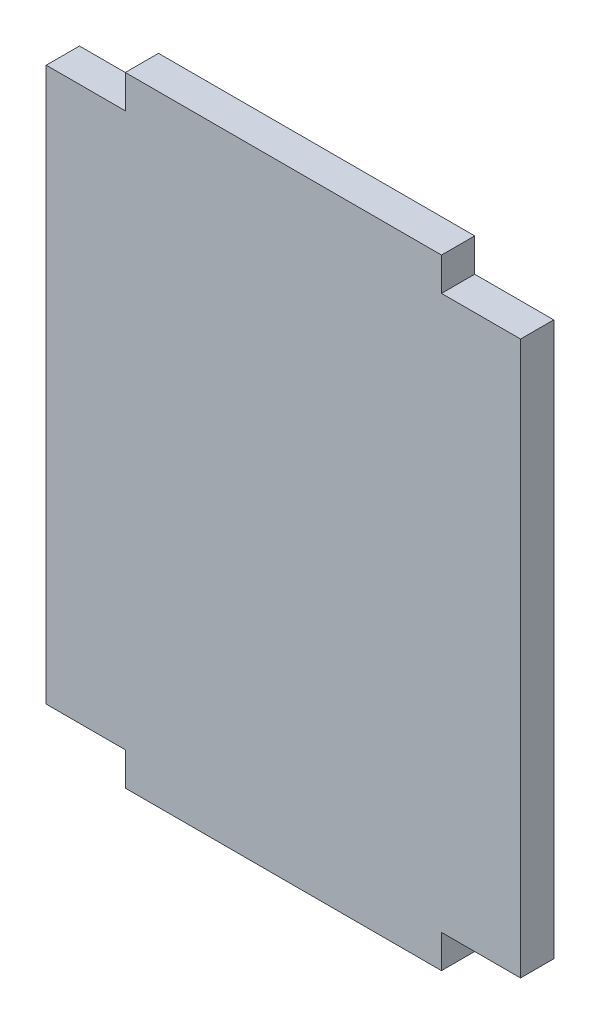
ISO-10303-21;
HEADER;
FILE_DESCRIPTION(('STEP AP214'),'2;1');
FILE_NAME('part.step','',(''),(''),'','','');
FILE_SCHEMA(('AUTOMOTIVE_DESIGN { 1 0 10303 214 1 1 1 1 }'));
ENDSEC;
DATA;
#1=APPLICATION_CONTEXT('core data for automotive mechanical design processes');
#2=APPLICATION_PROTOCOL_DEFINITION('international standard','automotive_design',2000,#1);
#3=PRODUCT_CONTEXT('',#1,'mechanical');
#4=PRODUCT('Part','Part','',(#3));
#5=PRODUCT_RELATED_PRODUCT_CATEGORY('part','',(#4));
#6=PRODUCT_DEFINITION_FORMATION('','',#4);
#7=PRODUCT_DEFINITION_CONTEXT('part definition',#1,'design');
#8=PRODUCT_DEFINITION('design','',#6,#7);
#9=PRODUCT_DEFINITION_SHAPE('','',#8);
#10=(LENGTH_UNIT() NAMED_UNIT(*) SI_UNIT(.MILLI.,.METRE.));
#11=(NAMED_UNIT(*) PLANE_ANGLE_UNIT() SI_UNIT($,.RADIAN.));
#12=(NAMED_UNIT(*) SI_UNIT($,.STERADIAN.) SOLID_ANGLE_UNIT());
#13=UNCERTAINTY_MEASURE_WITH_UNIT(LENGTH_MEASURE(1.E-05),#10,'distance_accuracy_value','');
#14=(GEOMETRIC_REPRESENTATION_CONTEXT(3) GLOBAL_UNCERTAINTY_ASSIGNED_CONTEXT((#13)) GLOBAL_UNIT_ASSIGNED_CONTEXT((#10,
#11,#12)) REPRESENTATION_CONTEXT('',''));
#15=CARTESIAN_POINT('',(0.,0.,0.));
#16=DIRECTION('',(0.,0.,1.));
#17=DIRECTION('',(1.,0.,0.));
#18=AXIS2_PLACEMENT_3D('',#15,#16,#17);
#19=CARTESIAN_POINT('',(0.,-5.334,5.334));
#20=DIRECTION('',(1.,0.,0.));
#21=DIRECTION('',(0.,0.,-1.));
#22=AXIS2_PLACEMENT_3D('',#19,#20,#21);
#23=PLANE('',#22);
#24=DIRECTION('',(0.,-1.,0.));
#25=VECTOR('',#24,1.);
#26=CARTESIAN_POINT('',(0.,-5.334,0.));
#27=LINE('',#26,#25);
#28=CARTESIAN_POINT('',(0.,0.,0.));
#29=VERTEX_POINT('',#28);
#30=CARTESIAN_POINT('',(0.,-5.334,0.));
#31=VERTEX_POINT('',#30);
#32=EDGE_CURVE('E267',#29,#31,#27,.T.);
#33=ORIENTED_EDGE('',*,*,#32,.T.);
#34=DIRECTION('',(0.,0.,-1.));
#35=VECTOR('',#34,1.);
#36=CARTESIAN_POINT('',(0.,-5.334,5.334));
#37=LINE('',#36,#35);
#38=CARTESIAN_POINT('',(0.,-5.334,5.334));
#39=VERTEX_POINT('',#38);
#40=EDGE_CURVE('E12',#39,#31,#37,.T.);
#41=ORIENTED_EDGE('',*,*,#40,.F.);
#42=DIRECTION('',(0.,-1.,0.));
#43=VECTOR('',#42,1.);
#44=CARTESIAN_POINT('',(0.,-5.334,5.334));
#45=LINE('',#44,#43);
#46=CARTESIAN_POINT('',(0.,0.,5.334));
#47=VERTEX_POINT('',#46);
#48=EDGE_CURVE('E205',#47,#39,#45,.T.);
#49=ORIENTED_EDGE('',*,*,#48,.F.);
#50=DIRECTION('',(0.,0.,-1.));
#51=VECTOR('',#50,1.);
#52=CARTESIAN_POINT('',(0.,0.,5.334));
#53=LINE('',#52,#51);
#54=EDGE_CURVE('E161',#47,#29,#53,.T.);
#55=ORIENTED_EDGE('',*,*,#54,.T.);
#56=EDGE_LOOP('',(#33,#41,#49,#55));
#57=FACE_BOUND('',#56,.T.);
#58=ADVANCED_FACE('F40',(#57),#23,.F.);
#59=CARTESIAN_POINT('',(-12.7,-5.334,5.334));
#60=DIRECTION('',(0.,-1.,0.));
#61=DIRECTION('',(1.,0.,0.));
#62=AXIS2_PLACEMENT_3D('',#59,#60,#61);
#63=PLANE('',#62);
#64=DIRECTION('',(-1.,0.,0.));
#65=VECTOR('',#64,1.);
#66=CARTESIAN_POINT('',(-12.7,-5.334,0.));
#67=LINE('',#66,#65);
#68=CARTESIAN_POINT('',(-12.7,-5.334,0.));
#69=VERTEX_POINT('',#68);
#70=EDGE_CURVE('E258',#31,#69,#67,.T.);
#71=ORIENTED_EDGE('',*,*,#70,.T.);
#72=DIRECTION('',(0.,0.,-1.));
#73=VECTOR('',#72,1.);
#74=CARTESIAN_POINT('',(-12.7,-5.334,5.334));
#75=LINE('',#74,#73);
#76=CARTESIAN_POINT('',(-12.7,-5.334,5.334));
#77=VERTEX_POINT('',#76);
#78=EDGE_CURVE('E49',#77,#69,#75,.T.);
#79=ORIENTED_EDGE('',*,*,#78,.F.);
#80=DIRECTION('',(-1.,0.,0.));
#81=VECTOR('',#80,1.);
#82=CARTESIAN_POINT('',(-12.7,-5.334,5.334));
#83=LINE('',#82,#81);
#84=EDGE_CURVE('E112',#39,#77,#83,.T.);
#85=ORIENTED_EDGE('',*,*,#84,.F.);
#86=ORIENTED_EDGE('',*,*,#40,.T.);
#87=EDGE_LOOP('',(#71,#79,#85,#86));
#88=FACE_BOUND('',#87,.T.);
#89=ADVANCED_FACE('F303',(#88),#63,.F.);
#90=CARTESIAN_POINT('',(-12.7,-94.234,5.334));
#91=DIRECTION('',(1.,0.,0.));
#92=DIRECTION('',(0.,1.,0.));
#93=AXIS2_PLACEMENT_3D('',#90,#91,#92);
#94=PLANE('',#93);
#95=DIRECTION('',(0.,-1.,0.));
#96=VECTOR('',#95,1.);
#97=CARTESIAN_POINT('',(-12.7,-94.234,0.));
#98=LINE('',#97,#96);
#99=CARTESIAN_POINT('',(-12.7,-94.234,0.));
#100=VERTEX_POINT('',#99);
#101=EDGE_CURVE('E253',#69,#100,#98,.T.);
#102=ORIENTED_EDGE('',*,*,#101,.T.);
#103=DIRECTION('',(0.,0.,-1.));
#104=VECTOR('',#103,1.);
#105=CARTESIAN_POINT('',(-12.7,-94.234,5.334));
#106=LINE('',#105,#104);
#107=CARTESIAN_POINT('',(-12.7,-94.234,5.334));
#108=VERTEX_POINT('',#107);
#109=EDGE_CURVE('E243',#108,#100,#106,.T.);
#110=ORIENTED_EDGE('',*,*,#109,.F.);
#111=DIRECTION('',(0.,-1.,0.));
#112=VECTOR('',#111,1.);
#113=CARTESIAN_POINT('',(-12.7,-94.234,5.334));
#114=LINE('',#113,#112);
#115=EDGE_CURVE('E197',#77,#108,#114,.T.);
#116=ORIENTED_EDGE('',*,*,#115,.F.);
#117=ORIENTED_EDGE('',*,*,#78,.T.);
#118=EDGE_LOOP('',(#102,#110,#116,#117));
#119=FACE_BOUND('',#118,.T.);
#120=ADVANCED_FACE('F251',(#119),#94,.F.);
#121=CARTESIAN_POINT('',(0.,-94.234,5.334));
#122=DIRECTION('',(0.,1.,0.));
#123=DIRECTION('',(0.,0.,1.));
#124=AXIS2_PLACEMENT_3D('',#121,#122,#123);
#125=PLANE('',#124);
#126=DIRECTION('',(1.,0.,0.));
#127=VECTOR('',#126,1.);
#128=CARTESIAN_POINT('',(0.,-94.234,0.));
#129=LINE('',#128,#127);
#130=CARTESIAN_POINT('',(0.,-94.234,0.));
#131=VERTEX_POINT('',#130);
#132=EDGE_CURVE('E260',#100,#131,#129,.T.);
#133=ORIENTED_EDGE('',*,*,#132,.T.);
#134=DIRECTION('',(0.,0.,-1.));
#135=VECTOR('',#134,1.);
#136=CARTESIAN_POINT('',(0.,-94.234,5.334));
#137=LINE('',#136,#135);
#138=CARTESIAN_POINT('',(0.,-94.234,5.334));
#139=VERTEX_POINT('',#138);
#140=EDGE_CURVE('E239',#139,#131,#137,.T.);
#141=ORIENTED_EDGE('',*,*,#140,.F.);
#142=DIRECTION('',(1.,0.,0.));
#143=VECTOR('',#142,1.);
#144=CARTESIAN_POINT('',(0.,-94.234,5.334));
#145=LINE('',#144,#143);
#146=EDGE_CURVE('E193',#108,#139,#145,.T.);
#147=ORIENTED_EDGE('',*,*,#146,.F.);
#148=ORIENTED_EDGE('',*,*,#109,.T.);
#149=EDGE_LOOP('',(#133,#141,#147,#148));
#150=FACE_BOUND('',#149,.T.);
#151=ADVANCED_FACE('F310',(#150),#125,.F.);
#152=CARTESIAN_POINT('',(0.,-99.568,5.334));
#153=DIRECTION('',(1.,0.,0.));
#154=DIRECTION('',(0.,0.,-1.));
#155=AXIS2_PLACEMENT_3D('',#152,#153,#154);
#156=PLANE('',#155);
#157=DIRECTION('',(0.,-1.,0.));
#158=VECTOR('',#157,1.);
#159=CARTESIAN_POINT('',(0.,-99.568,0.));
#160=LINE('',#159,#158);
#161=CARTESIAN_POINT('',(0.,-99.568,0.));
#162=VERTEX_POINT('',#161);
#163=EDGE_CURVE('E265',#131,#162,#160,.T.);
#164=ORIENTED_EDGE('',*,*,#163,.T.);
#165=DIRECTION('',(0.,0.,-1.));
#166=VECTOR('',#165,1.);
#167=CARTESIAN_POINT('',(0.,-99.568,5.334));
#168=LINE('',#167,#166);
#169=CARTESIAN_POINT('',(0.,-99.568,5.334));
#170=VERTEX_POINT('',#169);
#171=EDGE_CURVE('E235',#170,#162,#168,.T.);
#172=ORIENTED_EDGE('',*,*,#171,.F.);
#173=DIRECTION('',(0.,-1.,0.));
#174=VECTOR('',#173,1.);
#175=CARTESIAN_POINT('',(0.,-99.568,5.334));
#176=LINE('',#175,#174);
#177=EDGE_CURVE('E190',#139,#170,#176,.T.);
#178=ORIENTED_EDGE('',*,*,#177,.F.);
#179=ORIENTED_EDGE('',*,*,#140,.T.);
#180=EDGE_LOOP('',(#164,#172,#178,#179));
#181=FACE_BOUND('',#180,.T.);
#182=ADVANCED_FACE('F315',(#181),#156,.F.);
#183=CARTESIAN_POINT('',(50.8,-99.568,5.334));
#184=DIRECTION('',(0.,1.,0.));
#185=DIRECTION('',(0.,0.,1.));
#186=AXIS2_PLACEMENT_3D('',#183,#184,#185);
#187=PLANE('',#186);
#188=DIRECTION('',(1.,0.,0.));
#189=VECTOR('',#188,1.);
#190=CARTESIAN_POINT('',(50.8,-99.568,0.));
#191=LINE('',#190,#189);
#192=CARTESIAN_POINT('',(50.8,-99.568,0.));
#193=VERTEX_POINT('',#192);
#194=EDGE_CURVE('E272',#162,#193,#191,.T.);
#195=ORIENTED_EDGE('',*,*,#194,.T.);
#196=DIRECTION('',(0.,0.,-1.));
#197=VECTOR('',#196,1.);
#198=CARTESIAN_POINT('',(50.8,-99.568,5.334));
#199=LINE('',#198,#197);
#200=CARTESIAN_POINT('',(50.8,-99.568,5.334));
#201=VERTEX_POINT('',#200);
#202=EDGE_CURVE('E231',#201,#193,#199,.T.);
#203=ORIENTED_EDGE('',*,*,#202,.F.);
#204=DIRECTION('',(1.,0.,0.));
#205=VECTOR('',#204,1.);
#206=CARTESIAN_POINT('',(50.8,-99.568,5.334));
#207=LINE('',#206,#205);
#208=EDGE_CURVE('E182',#170,#201,#207,.T.);
#209=ORIENTED_EDGE('',*,*,#208,.F.);
#210=ORIENTED_EDGE('',*,*,#171,.T.);
#211=EDGE_LOOP('',(#195,#203,#209,#210));
#212=FACE_BOUND('',#211,.T.);
#213=ADVANCED_FACE('F319',(#212),#187,.F.);
#214=CARTESIAN_POINT('',(50.8,-94.234,5.334));
#215=DIRECTION('',(-1.,0.,0.));
#216=DIRECTION('',(0.,0.,1.));
#217=AXIS2_PLACEMENT_3D('',#214,#215,#216);
#218=PLANE('',#217);
#219=DIRECTION('',(0.,1.,0.));
#220=VECTOR('',#219,1.);
#221=CARTESIAN_POINT('',(50.8,-94.234,0.));
#222=LINE('',#221,#220);
#223=CARTESIAN_POINT('',(50.8,-94.234,0.));
#224=VERTEX_POINT('',#223);
#225=EDGE_CURVE('E275',#193,#224,#222,.T.);
#226=ORIENTED_EDGE('',*,*,#225,.T.);
#227=DIRECTION('',(0.,0.,-1.));
#228=VECTOR('',#227,1.);
#229=CARTESIAN_POINT('',(50.8,-94.234,5.334));
#230=LINE('',#229,#228);
#231=CARTESIAN_POINT('',(50.8,-94.234,5.334));
#232=VERTEX_POINT('',#231);
#233=EDGE_CURVE('E227',#232,#224,#230,.T.);
#234=ORIENTED_EDGE('',*,*,#233,.F.);
#235=DIRECTION('',(0.,1.,0.));
#236=VECTOR('',#235,1.);
#237=CARTESIAN_POINT('',(50.8,-94.234,5.334));
#238=LINE('',#237,#236);
#239=EDGE_CURVE('E178',#201,#232,#238,.T.);
#240=ORIENTED_EDGE('',*,*,#239,.F.);
#241=ORIENTED_EDGE('',*,*,#202,.T.);
#242=EDGE_LOOP('',(#226,#234,#240,#241));
#243=FACE_BOUND('',#242,.T.);
#244=ADVANCED_FACE('F323',(#243),#218,.F.);
#245=CARTESIAN_POINT('',(63.5,-94.234,5.334));
#246=DIRECTION('',(0.,1.,0.));
#247=DIRECTION('',(0.,0.,1.));
#248=AXIS2_PLACEMENT_3D('',#245,#246,#247);
#249=PLANE('',#248);
#250=DIRECTION('',(1.,0.,0.));
#251=VECTOR('',#250,1.);
#252=CARTESIAN_POINT('',(63.5,-94.234,0.));
#253=LINE('',#252,#251);
#254=CARTESIAN_POINT('',(63.5,-94.234,0.));
#255=VERTEX_POINT('',#254);
#256=EDGE_CURVE('E278',#224,#255,#253,.T.);
#257=ORIENTED_EDGE('',*,*,#256,.T.);
#258=DIRECTION('',(0.,0.,-1.));
#259=VECTOR('',#258,1.);
#260=CARTESIAN_POINT('',(63.5,-94.234,5.334));
#261=LINE('',#260,#259);
#262=CARTESIAN_POINT('',(63.5,-94.234,5.334));
#263=VERTEX_POINT('',#262);
#264=EDGE_CURVE('E223',#263,#255,#261,.T.);
#265=ORIENTED_EDGE('',*,*,#264,.F.);
#266=DIRECTION('',(1.,0.,0.));
#267=VECTOR('',#266,1.);
#268=CARTESIAN_POINT('',(63.5,-94.234,5.334));
#269=LINE('',#268,#267);
#270=EDGE_CURVE('E174',#232,#263,#269,.T.);
#271=ORIENTED_EDGE('',*,*,#270,.F.);
#272=ORIENTED_EDGE('',*,*,#233,.T.);
#273=EDGE_LOOP('',(#257,#265,#271,#272));
#274=FACE_BOUND('',#273,.T.);
#275=ADVANCED_FACE('F327',(#274),#249,.F.);
#276=CARTESIAN_POINT('',(63.5,-5.334,5.334));
#277=DIRECTION('',(-1.,0.,0.));
#278=DIRECTION('',(0.,0.,1.));
#279=AXIS2_PLACEMENT_3D('',#276,#277,#278);
#280=PLANE('',#279);
#281=DIRECTION('',(0.,1.,0.));
#282=VECTOR('',#281,1.);
#283=CARTESIAN_POINT('',(63.5,-5.334,0.));
#284=LINE('',#283,#282);
#285=CARTESIAN_POINT('',(63.5,-5.334,0.));
#286=VERTEX_POINT('',#285);
#287=EDGE_CURVE('E281',#255,#286,#284,.T.);
#288=ORIENTED_EDGE('',*,*,#287,.T.);
#289=DIRECTION('',(0.,0.,-1.));
#290=VECTOR('',#289,1.);
#291=CARTESIAN_POINT('',(63.5,-5.334,5.334));
#292=LINE('',#291,#290);
#293=CARTESIAN_POINT('',(63.5,-5.334,5.334));
#294=VERTEX_POINT('',#293);
#295=EDGE_CURVE('E154',#294,#286,#292,.T.);
#296=ORIENTED_EDGE('',*,*,#295,.F.);
#297=DIRECTION('',(0.,1.,0.));
#298=VECTOR('',#297,1.);
#299=CARTESIAN_POINT('',(63.5,-5.334,5.334));
#300=LINE('',#299,#298);
#301=EDGE_CURVE('E143',#263,#294,#300,.T.);
#302=ORIENTED_EDGE('',*,*,#301,.F.);
#303=ORIENTED_EDGE('',*,*,#264,.T.);
#304=EDGE_LOOP('',(#288,#296,#302,#303));
#305=FACE_BOUND('',#304,.T.);
#306=ADVANCED_FACE('F286',(#305),#280,.F.);
#307=CARTESIAN_POINT('',(50.8,-5.33399999999999,5.334));
#308=DIRECTION('',(0.,-1.,0.));
#309=DIRECTION('',(1.,0.,0.));
#310=AXIS2_PLACEMENT_3D('',#307,#308,#309);
#311=PLANE('',#310);
#312=DIRECTION('',(-1.,0.,0.));
#313=VECTOR('',#312,1.);
#314=CARTESIAN_POINT('',(50.8,-5.33399999999999,0.));
#315=LINE('',#314,#313);
#316=CARTESIAN_POINT('',(50.8,-5.33399999999999,0.));
#317=VERTEX_POINT('',#316);
#318=EDGE_CURVE('E152',#286,#317,#315,.T.);
#319=ORIENTED_EDGE('',*,*,#318,.T.);
#320=DIRECTION('',(0.,0.,-1.));
#321=VECTOR('',#320,1.);
#322=CARTESIAN_POINT('',(50.8,-5.33399999999999,5.334));
#323=LINE('',#322,#321);
#324=CARTESIAN_POINT('',(50.8,-5.33399999999999,5.334));
#325=VERTEX_POINT('',#324);
#326=EDGE_CURVE('E149',#325,#317,#323,.T.);
#327=ORIENTED_EDGE('',*,*,#326,.F.);
#328=DIRECTION('',(-1.,0.,0.));
#329=VECTOR('',#328,1.);
#330=CARTESIAN_POINT('',(50.8,-5.33399999999999,5.334));
#331=LINE('',#330,#329);
#332=EDGE_CURVE('E137',#294,#325,#331,.T.);
#333=ORIENTED_EDGE('',*,*,#332,.F.);
#334=ORIENTED_EDGE('',*,*,#295,.T.);
#335=EDGE_LOOP('',(#319,#327,#333,#334));
#336=FACE_BOUND('',#335,.T.);
#337=ADVANCED_FACE('F150',(#336),#311,.F.);
#338=CARTESIAN_POINT('',(50.8,0.,5.334));
#339=DIRECTION('',(-1.,0.,0.));
#340=DIRECTION('',(0.,0.,1.));
#341=AXIS2_PLACEMENT_3D('',#338,#339,#340);
#342=PLANE('',#341);
#343=DIRECTION('',(0.,1.,0.));
#344=VECTOR('',#343,1.);
#345=CARTESIAN_POINT('',(50.8,0.,0.));
#346=LINE('',#345,#344);
#347=CARTESIAN_POINT('',(50.8,0.,0.));
#348=VERTEX_POINT('',#347);
#349=EDGE_CURVE('E98',#317,#348,#346,.T.);
#350=ORIENTED_EDGE('',*,*,#349,.T.);
#351=DIRECTION('',(0.,0.,-1.));
#352=VECTOR('',#351,1.);
#353=CARTESIAN_POINT('',(50.8,0.,5.334));
#354=LINE('',#353,#352);
#355=CARTESIAN_POINT('',(50.8,0.,5.334));
#356=VERTEX_POINT('',#355);
#357=EDGE_CURVE('E155',#356,#348,#354,.T.);
#358=ORIENTED_EDGE('',*,*,#357,.F.);
#359=DIRECTION('',(0.,1.,0.));
#360=VECTOR('',#359,1.);
#361=CARTESIAN_POINT('',(50.8,0.,5.334));
#362=LINE('',#361,#360);
#363=EDGE_CURVE('E141',#325,#356,#362,.T.);
#364=ORIENTED_EDGE('',*,*,#363,.F.);
#365=ORIENTED_EDGE('',*,*,#326,.T.);
#366=EDGE_LOOP('',(#350,#358,#364,#365));
#367=FACE_BOUND('',#366,.T.);
#368=ADVANCED_FACE('F157',(#367),#342,.F.);
#369=CARTESIAN_POINT('',(0.,0.,5.334));
#370=DIRECTION('',(0.,-1.,0.));
#371=DIRECTION('',(0.,0.,-1.));
#372=AXIS2_PLACEMENT_3D('',#369,#370,#371);
#373=PLANE('',#372);
#374=DIRECTION('',(-1.,0.,0.));
#375=VECTOR('',#374,1.);
#376=CARTESIAN_POINT('',(0.,0.,0.));
#377=LINE('',#376,#375);
#378=EDGE_CURVE('E104',#348,#29,#377,.T.);
#379=ORIENTED_EDGE('',*,*,#378,.T.);
#380=ORIENTED_EDGE('',*,*,#54,.F.);
#381=DIRECTION('',(-1.,0.,0.));
#382=VECTOR('',#381,1.);
#383=CARTESIAN_POINT('',(0.,0.,5.334));
#384=LINE('',#383,#382);
#385=EDGE_CURVE('E57',#356,#47,#384,.T.);
#386=ORIENTED_EDGE('',*,*,#385,.F.);
#387=ORIENTED_EDGE('',*,*,#357,.T.);
#388=EDGE_LOOP('',(#379,#380,#386,#387));
#389=FACE_BOUND('',#388,.T.);
#390=ADVANCED_FACE('F292',(#389),#373,.F.);
#391=CARTESIAN_POINT('',(0.,0.,5.334));
#392=DIRECTION('',(0.,0.,-1.));
#393=DIRECTION('',(-1.,0.,0.));
#394=AXIS2_PLACEMENT_3D('',#391,#392,#393);
#395=PLANE('',#394);
#396=ORIENTED_EDGE('',*,*,#48,.T.);
#397=ORIENTED_EDGE('',*,*,#84,.T.);
#398=ORIENTED_EDGE('',*,*,#115,.T.);
#399=ORIENTED_EDGE('',*,*,#146,.T.);
#400=ORIENTED_EDGE('',*,*,#177,.T.);
#401=ORIENTED_EDGE('',*,*,#208,.T.);
#402=ORIENTED_EDGE('',*,*,#239,.T.);
#403=ORIENTED_EDGE('',*,*,#270,.T.);
#404=ORIENTED_EDGE('',*,*,#301,.T.);
#405=ORIENTED_EDGE('',*,*,#332,.T.);
#406=ORIENTED_EDGE('',*,*,#363,.T.);
#407=ORIENTED_EDGE('',*,*,#385,.T.);
#408=EDGE_LOOP('',(#396,#397,#398,#399,#400,#401,#402,#403,#404,#405,#406,#407));
#409=FACE_BOUND('',#408,.T.);
#410=ADVANCED_FACE('F139',(#409),#395,.F.);
#411=CARTESIAN_POINT('',(0.,0.,0.));
#412=DIRECTION('',(0.,0.,-1.));
#413=DIRECTION('',(-1.,0.,0.));
#414=AXIS2_PLACEMENT_3D('',#411,#412,#413);
#415=PLANE('',#414);
#416=ORIENTED_EDGE('',*,*,#32,.F.);
#417=ORIENTED_EDGE('',*,*,#378,.F.);
#418=ORIENTED_EDGE('',*,*,#349,.F.);
#419=ORIENTED_EDGE('',*,*,#318,.F.);
#420=ORIENTED_EDGE('',*,*,#287,.F.);
#421=ORIENTED_EDGE('',*,*,#256,.F.);
#422=ORIENTED_EDGE('',*,*,#225,.F.);
#423=ORIENTED_EDGE('',*,*,#194,.F.);
#424=ORIENTED_EDGE('',*,*,#163,.F.);
#425=ORIENTED_EDGE('',*,*,#132,.F.);
#426=ORIENTED_EDGE('',*,*,#101,.F.);
#427=ORIENTED_EDGE('',*,*,#70,.F.);
#428=EDGE_LOOP('',(#416,#417,#418,#419,#420,#421,#422,#423,#424,#425,#426,#427));
#429=FACE_BOUND('',#428,.T.);
#430=ADVANCED_FACE('F257',(#429),#415,.T.);
#431=CLOSED_SHELL('',(#58,#89,#120,#151,#182,#213,#244,#275,#306,#337,#368,#390,#410,#430));
#432=MANIFOLD_SOLID_BREP('B2',#431);
#433=ADVANCED_BREP_SHAPE_REPRESENTATION('',(#18,#432),#14);
#434=SHAPE_DEFINITION_REPRESENTATION(#9,#433);
ENDSEC;
END-ISO-10303-21;
